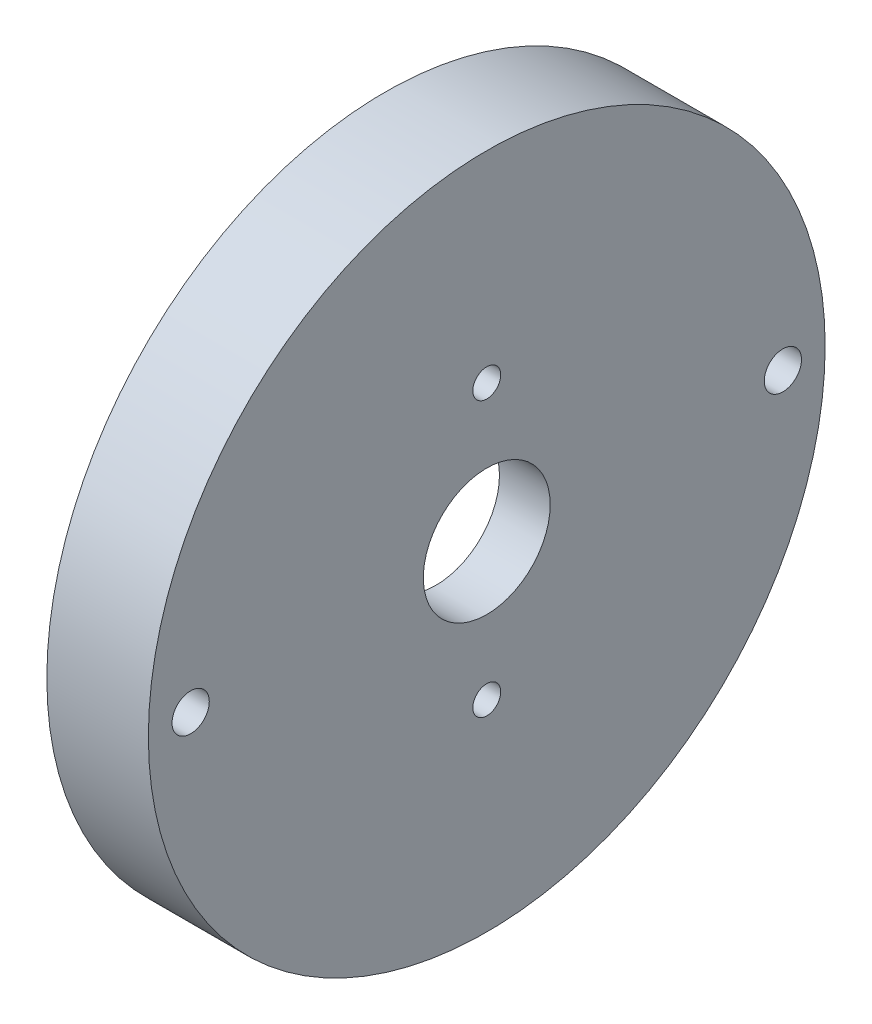
ISO-10303-21;
HEADER;
FILE_DESCRIPTION(('STEP AP214'),'2;1');
FILE_NAME('part.step','',(''),(''),'','','');
FILE_SCHEMA(('AUTOMOTIVE_DESIGN { 1 0 10303 214 1 1 1 1 }'));
ENDSEC;
DATA;
#1=APPLICATION_CONTEXT('core data for automotive mechanical design processes');
#2=APPLICATION_PROTOCOL_DEFINITION('international standard','automotive_design',2000,#1);
#3=PRODUCT_CONTEXT('',#1,'mechanical');
#4=PRODUCT('Part','Part','',(#3));
#5=PRODUCT_RELATED_PRODUCT_CATEGORY('part','',(#4));
#6=PRODUCT_DEFINITION_FORMATION('','',#4);
#7=PRODUCT_DEFINITION_CONTEXT('part definition',#1,'design');
#8=PRODUCT_DEFINITION('design','',#6,#7);
#9=PRODUCT_DEFINITION_SHAPE('','',#8);
#10=(LENGTH_UNIT() NAMED_UNIT(*) SI_UNIT(.MILLI.,.METRE.));
#11=(NAMED_UNIT(*) PLANE_ANGLE_UNIT() SI_UNIT($,.RADIAN.));
#12=(NAMED_UNIT(*) SI_UNIT($,.STERADIAN.) SOLID_ANGLE_UNIT());
#13=UNCERTAINTY_MEASURE_WITH_UNIT(LENGTH_MEASURE(1.E-05),#10,'distance_accuracy_value','');
#14=(GEOMETRIC_REPRESENTATION_CONTEXT(3) GLOBAL_UNCERTAINTY_ASSIGNED_CONTEXT((#13)) GLOBAL_UNIT_ASSIGNED_CONTEXT((#10,
#11,#12)) REPRESENTATION_CONTEXT('',''));
#15=CARTESIAN_POINT('',(0.,0.,0.));
#16=DIRECTION('',(0.,0.,1.));
#17=DIRECTION('',(1.,0.,0.));
#18=AXIS2_PLACEMENT_3D('',#15,#16,#17);
#19=CARTESIAN_POINT('',(6.,0.,0.));
#20=DIRECTION('',(-1.,0.,0.));
#21=DIRECTION('',(0.,0.,1.));
#22=AXIS2_PLACEMENT_3D('',#19,#20,#21);
#23=CYLINDRICAL_SURFACE('',#22,27.5);
#24=CARTESIAN_POINT('',(6.,0.,0.));
#25=DIRECTION('',(1.,0.,0.));
#26=DIRECTION('',(0.,0.,-1.));
#27=AXIS2_PLACEMENT_3D('',#24,#25,#26);
#28=CIRCLE('',#27,27.5);
#29=CARTESIAN_POINT('',(6.,0.,-27.5));
#30=VERTEX_POINT('',#29);
#31=EDGE_CURVE('E43',#30,#30,#28,.T.);
#32=ORIENTED_EDGE('',*,*,#31,.T.);
#33=EDGE_LOOP('',(#32));
#34=FACE_BOUND('',#33,.T.);
#35=CARTESIAN_POINT('',(0.,0.,0.));
#36=DIRECTION('',(1.,0.,0.));
#37=DIRECTION('',(0.,0.,-1.));
#38=AXIS2_PLACEMENT_3D('',#35,#36,#37);
#39=CIRCLE('',#38,27.5);
#40=CARTESIAN_POINT('',(0.,0.,-27.5));
#41=VERTEX_POINT('',#40);
#42=EDGE_CURVE('E39',#41,#41,#39,.T.);
#43=ORIENTED_EDGE('',*,*,#42,.F.);
#44=EDGE_LOOP('',(#43));
#45=FACE_BOUND('',#44,.T.);
#46=ADVANCED_FACE('F33',(#34,#45),#23,.F.);
#47=CARTESIAN_POINT('',(6.,0.,0.));
#48=DIRECTION('',(-1.,0.,0.));
#49=DIRECTION('',(0.,0.,1.));
#50=AXIS2_PLACEMENT_3D('',#47,#48,#49);
#51=CYLINDRICAL_SURFACE('',#50,40.);
#52=CARTESIAN_POINT('',(0.,0.,0.));
#53=DIRECTION('',(1.,0.,0.));
#54=DIRECTION('',(0.,0.,-1.));
#55=AXIS2_PLACEMENT_3D('',#52,#53,#54);
#56=CIRCLE('',#55,40.);
#57=CARTESIAN_POINT('',(0.,0.,-40.));
#58=VERTEX_POINT('',#57);
#59=EDGE_CURVE('E10',#58,#58,#56,.T.);
#60=ORIENTED_EDGE('',*,*,#59,.T.);
#61=EDGE_LOOP('',(#60));
#62=FACE_BOUND('',#61,.T.);
#63=CARTESIAN_POINT('',(12.,0.,0.));
#64=DIRECTION('',(1.,0.,0.));
#65=DIRECTION('',(0.,0.,-1.));
#66=AXIS2_PLACEMENT_3D('',#63,#64,#65);
#67=CIRCLE('',#66,40.);
#68=CARTESIAN_POINT('',(12.,0.,-40.));
#69=VERTEX_POINT('',#68);
#70=EDGE_CURVE('E53',#69,#69,#67,.T.);
#71=ORIENTED_EDGE('',*,*,#70,.F.);
#72=EDGE_LOOP('',(#71));
#73=FACE_BOUND('',#72,.T.);
#74=ADVANCED_FACE('F133',(#62,#73),#51,.T.);
#75=CARTESIAN_POINT('',(0.,0.,0.));
#76=DIRECTION('',(1.,0.,0.));
#77=DIRECTION('',(0.,0.,-1.));
#78=AXIS2_PLACEMENT_3D('',#75,#76,#77);
#79=PLANE('',#78);
#80=CARTESIAN_POINT('',(0.,0.,35.));
#81=DIRECTION('',(1.,0.,0.));
#82=DIRECTION('',(0.,0.,-1.));
#83=AXIS2_PLACEMENT_3D('',#80,#81,#82);
#84=CIRCLE('',#83,1.2);
#85=CARTESIAN_POINT('',(0.,0.,33.8));
#86=VERTEX_POINT('',#85);
#87=EDGE_CURVE('E82',#86,#86,#84,.T.);
#88=ORIENTED_EDGE('',*,*,#87,.T.);
#89=EDGE_LOOP('',(#88));
#90=FACE_BOUND('',#89,.T.);
#91=CARTESIAN_POINT('',(0.,0.,-35.));
#92=DIRECTION('',(1.,0.,0.));
#93=DIRECTION('',(0.,0.,-1.));
#94=AXIS2_PLACEMENT_3D('',#91,#92,#93);
#95=CIRCLE('',#94,1.2);
#96=CARTESIAN_POINT('',(0.,0.,-36.2));
#97=VERTEX_POINT('',#96);
#98=EDGE_CURVE('E60',#97,#97,#95,.T.);
#99=ORIENTED_EDGE('',*,*,#98,.T.);
#100=EDGE_LOOP('',(#99));
#101=FACE_BOUND('',#100,.T.);
#102=ORIENTED_EDGE('',*,*,#42,.T.);
#103=EDGE_LOOP('',(#102));
#104=FACE_BOUND('',#103,.T.);
#105=ORIENTED_EDGE('',*,*,#59,.F.);
#106=EDGE_LOOP('',(#105));
#107=FACE_BOUND('',#106,.T.);
#108=ADVANCED_FACE('F123',(#90,#101,#104,#107),#79,.F.);
#109=CARTESIAN_POINT('',(6.,0.,0.));
#110=DIRECTION('',(1.,0.,0.));
#111=DIRECTION('',(0.,0.,-1.));
#112=AXIS2_PLACEMENT_3D('',#109,#110,#111);
#113=PLANE('',#112);
#114=CARTESIAN_POINT('',(6.,0.,0.));
#115=DIRECTION('',(1.,0.,0.));
#116=DIRECTION('',(0.,0.,-1.));
#117=AXIS2_PLACEMENT_3D('',#114,#115,#116);
#118=CIRCLE('',#117,7.5);
#119=CARTESIAN_POINT('',(6.,0.,-7.5));
#120=VERTEX_POINT('',#119);
#121=EDGE_CURVE('E50',#120,#120,#118,.T.);
#122=ORIENTED_EDGE('',*,*,#121,.T.);
#123=EDGE_LOOP('',(#122));
#124=FACE_BOUND('',#123,.T.);
#125=CARTESIAN_POINT('',(6.,16.22,0.));
#126=DIRECTION('',(1.,0.,0.));
#127=DIRECTION('',(0.,0.,-1.));
#128=AXIS2_PLACEMENT_3D('',#125,#126,#127);
#129=CIRCLE('',#128,1.65);
#130=CARTESIAN_POINT('',(6.,16.22,-1.65));
#131=VERTEX_POINT('',#130);
#132=EDGE_CURVE('E54',#131,#131,#129,.T.);
#133=ORIENTED_EDGE('',*,*,#132,.T.);
#134=EDGE_LOOP('',(#133));
#135=FACE_BOUND('',#134,.T.);
#136=CARTESIAN_POINT('',(6.,-16.22,0.));
#137=DIRECTION('',(1.,0.,0.));
#138=DIRECTION('',(0.,0.,-1.));
#139=AXIS2_PLACEMENT_3D('',#136,#137,#138);
#140=CIRCLE('',#139,1.65);
#141=CARTESIAN_POINT('',(6.,-16.22,-1.65));
#142=VERTEX_POINT('',#141);
#143=EDGE_CURVE('E57',#142,#142,#140,.T.);
#144=ORIENTED_EDGE('',*,*,#143,.T.);
#145=EDGE_LOOP('',(#144));
#146=FACE_BOUND('',#145,.T.);
#147=ORIENTED_EDGE('',*,*,#31,.F.);
#148=EDGE_LOOP('',(#147));
#149=FACE_BOUND('',#148,.T.);
#150=ADVANCED_FACE('F119',(#124,#135,#146,#149),#113,.F.);
#151=CARTESIAN_POINT('',(12.,16.22,0.));
#152=DIRECTION('',(-1.,0.,0.));
#153=DIRECTION('',(0.,0.,1.));
#154=AXIS2_PLACEMENT_3D('',#151,#152,#153);
#155=CYLINDRICAL_SURFACE('',#154,1.65);
#156=CARTESIAN_POINT('',(12.,16.22,0.));
#157=DIRECTION('',(1.,0.,0.));
#158=DIRECTION('',(0.,0.,-1.));
#159=AXIS2_PLACEMENT_3D('',#156,#157,#158);
#160=CIRCLE('',#159,1.65);
#161=CARTESIAN_POINT('',(12.,16.22,-1.65));
#162=VERTEX_POINT('',#161);
#163=EDGE_CURVE('E63',#162,#162,#160,.T.);
#164=ORIENTED_EDGE('',*,*,#163,.T.);
#165=EDGE_LOOP('',(#164));
#166=FACE_BOUND('',#165,.T.);
#167=ORIENTED_EDGE('',*,*,#132,.F.);
#168=EDGE_LOOP('',(#167));
#169=FACE_BOUND('',#168,.T.);
#170=ADVANCED_FACE('F122',(#166,#169),#155,.F.);
#171=CARTESIAN_POINT('',(12.,-16.22,0.));
#172=DIRECTION('',(-1.,0.,0.));
#173=DIRECTION('',(0.,0.,1.));
#174=AXIS2_PLACEMENT_3D('',#171,#172,#173);
#175=CYLINDRICAL_SURFACE('',#174,1.65);
#176=CARTESIAN_POINT('',(12.,-16.22,0.));
#177=DIRECTION('',(1.,0.,0.));
#178=DIRECTION('',(0.,0.,-1.));
#179=AXIS2_PLACEMENT_3D('',#176,#177,#178);
#180=CIRCLE('',#179,1.65);
#181=CARTESIAN_POINT('',(12.,-16.22,-1.65));
#182=VERTEX_POINT('',#181);
#183=EDGE_CURVE('E66',#182,#182,#180,.T.);
#184=ORIENTED_EDGE('',*,*,#183,.T.);
#185=EDGE_LOOP('',(#184));
#186=FACE_BOUND('',#185,.T.);
#187=ORIENTED_EDGE('',*,*,#143,.F.);
#188=EDGE_LOOP('',(#187));
#189=FACE_BOUND('',#188,.T.);
#190=ADVANCED_FACE('F115',(#186,#189),#175,.F.);
#191=CARTESIAN_POINT('',(12.,0.,0.));
#192=DIRECTION('',(-1.,0.,0.));
#193=DIRECTION('',(0.,0.,1.));
#194=AXIS2_PLACEMENT_3D('',#191,#192,#193);
#195=CYLINDRICAL_SURFACE('',#194,7.5);
#196=CARTESIAN_POINT('',(12.,0.,0.));
#197=DIRECTION('',(1.,0.,0.));
#198=DIRECTION('',(0.,0.,-1.));
#199=AXIS2_PLACEMENT_3D('',#196,#197,#198);
#200=CIRCLE('',#199,7.5);
#201=CARTESIAN_POINT('',(12.,0.,-7.5));
#202=VERTEX_POINT('',#201);
#203=EDGE_CURVE('E47',#202,#202,#200,.T.);
#204=ORIENTED_EDGE('',*,*,#203,.T.);
#205=EDGE_LOOP('',(#204));
#206=FACE_BOUND('',#205,.T.);
#207=ORIENTED_EDGE('',*,*,#121,.F.);
#208=EDGE_LOOP('',(#207));
#209=FACE_BOUND('',#208,.T.);
#210=ADVANCED_FACE('F101',(#206,#209),#195,.F.);
#211=CARTESIAN_POINT('',(12.,0.,0.));
#212=DIRECTION('',(1.,0.,0.));
#213=DIRECTION('',(0.,0.,-1.));
#214=AXIS2_PLACEMENT_3D('',#211,#212,#213);
#215=PLANE('',#214);
#216=CARTESIAN_POINT('',(12.,0.,35.));
#217=DIRECTION('',(1.,0.,0.));
#218=DIRECTION('',(0.,0.,-1.));
#219=AXIS2_PLACEMENT_3D('',#216,#217,#218);
#220=CIRCLE('',#219,2.2);
#221=CARTESIAN_POINT('',(12.,0.,32.8));
#222=VERTEX_POINT('',#221);
#223=EDGE_CURVE('E91',#222,#222,#220,.T.);
#224=ORIENTED_EDGE('',*,*,#223,.F.);
#225=EDGE_LOOP('',(#224));
#226=FACE_BOUND('',#225,.T.);
#227=CARTESIAN_POINT('',(12.,0.,-35.));
#228=DIRECTION('',(1.,0.,0.));
#229=DIRECTION('',(0.,0.,-1.));
#230=AXIS2_PLACEMENT_3D('',#227,#228,#229);
#231=CIRCLE('',#230,2.2);
#232=CARTESIAN_POINT('',(12.,0.,-37.2));
#233=VERTEX_POINT('',#232);
#234=EDGE_CURVE('E79',#233,#233,#231,.T.);
#235=ORIENTED_EDGE('',*,*,#234,.F.);
#236=EDGE_LOOP('',(#235));
#237=FACE_BOUND('',#236,.T.);
#238=ORIENTED_EDGE('',*,*,#70,.T.);
#239=EDGE_LOOP('',(#238));
#240=FACE_BOUND('',#239,.T.);
#241=ORIENTED_EDGE('',*,*,#183,.F.);
#242=EDGE_LOOP('',(#241));
#243=FACE_BOUND('',#242,.T.);
#244=ORIENTED_EDGE('',*,*,#163,.F.);
#245=EDGE_LOOP('',(#244));
#246=FACE_BOUND('',#245,.T.);
#247=ORIENTED_EDGE('',*,*,#203,.F.);
#248=EDGE_LOOP('',(#247));
#249=FACE_BOUND('',#248,.T.);
#250=ADVANCED_FACE('F97',(#226,#237,#240,#243,#246,#249),#215,.T.);
#251=CARTESIAN_POINT('',(12.,0.,-35.));
#252=DIRECTION('',(1.,0.,0.));
#253=DIRECTION('',(0.,0.,-1.));
#254=AXIS2_PLACEMENT_3D('',#251,#252,#253);
#255=CYLINDRICAL_SURFACE('',#254,1.2);
#256=ORIENTED_EDGE('',*,*,#98,.F.);
#257=EDGE_LOOP('',(#256));
#258=FACE_BOUND('',#257,.T.);
#259=CARTESIAN_POINT('',(3.75,0.,-35.));
#260=DIRECTION('',(1.,0.,0.));
#261=DIRECTION('',(0.,0.,-1.));
#262=AXIS2_PLACEMENT_3D('',#259,#260,#261);
#263=CIRCLE('',#262,1.2);
#264=CARTESIAN_POINT('',(3.75,0.,-36.2));
#265=VERTEX_POINT('',#264);
#266=EDGE_CURVE('E73',#265,#265,#263,.T.);
#267=ORIENTED_EDGE('',*,*,#266,.T.);
#268=EDGE_LOOP('',(#267));
#269=FACE_BOUND('',#268,.T.);
#270=ADVANCED_FACE('F100',(#258,#269),#255,.F.);
#271=CARTESIAN_POINT('',(3.75,1.20000000000001,-35.));
#272=DIRECTION('',(-1.,0.,0.));
#273=DIRECTION('',(0.,0.,1.));
#274=AXIS2_PLACEMENT_3D('',#271,#272,#273);
#275=PLANE('',#274);
#276=ORIENTED_EDGE('',*,*,#266,.F.);
#277=EDGE_LOOP('',(#276));
#278=FACE_BOUND('',#277,.T.);
#279=CARTESIAN_POINT('',(3.75,0.,-35.));
#280=DIRECTION('',(1.,0.,0.));
#281=DIRECTION('',(0.,0.,-1.));
#282=AXIS2_PLACEMENT_3D('',#279,#280,#281);
#283=CIRCLE('',#282,2.2);
#284=CARTESIAN_POINT('',(3.75,0.,-37.2));
#285=VERTEX_POINT('',#284);
#286=EDGE_CURVE('E76',#285,#285,#283,.T.);
#287=ORIENTED_EDGE('',*,*,#286,.T.);
#288=EDGE_LOOP('',(#287));
#289=FACE_BOUND('',#288,.T.);
#290=ADVANCED_FACE('F152',(#278,#289),#275,.F.);
#291=CARTESIAN_POINT('',(12.,0.,-35.));
#292=DIRECTION('',(1.,0.,0.));
#293=DIRECTION('',(0.,0.,-1.));
#294=AXIS2_PLACEMENT_3D('',#291,#292,#293);
#295=CYLINDRICAL_SURFACE('',#294,2.2);
#296=ORIENTED_EDGE('',*,*,#286,.F.);
#297=EDGE_LOOP('',(#296));
#298=FACE_BOUND('',#297,.T.);
#299=ORIENTED_EDGE('',*,*,#234,.T.);
#300=EDGE_LOOP('',(#299));
#301=FACE_BOUND('',#300,.T.);
#302=ADVANCED_FACE('F156',(#298,#301),#295,.F.);
#303=CARTESIAN_POINT('',(12.,0.,35.));
#304=DIRECTION('',(1.,0.,0.));
#305=DIRECTION('',(0.,0.,-1.));
#306=AXIS2_PLACEMENT_3D('',#303,#304,#305);
#307=CYLINDRICAL_SURFACE('',#306,1.2);
#308=ORIENTED_EDGE('',*,*,#87,.F.);
#309=EDGE_LOOP('',(#308));
#310=FACE_BOUND('',#309,.T.);
#311=CARTESIAN_POINT('',(3.75,0.,35.));
#312=DIRECTION('',(1.,0.,0.));
#313=DIRECTION('',(0.,0.,-1.));
#314=AXIS2_PLACEMENT_3D('',#311,#312,#313);
#315=CIRCLE('',#314,1.2);
#316=CARTESIAN_POINT('',(3.75,0.,33.8));
#317=VERTEX_POINT('',#316);
#318=EDGE_CURVE('E85',#317,#317,#315,.T.);
#319=ORIENTED_EDGE('',*,*,#318,.T.);
#320=EDGE_LOOP('',(#319));
#321=FACE_BOUND('',#320,.T.);
#322=ADVANCED_FACE('F160',(#310,#321),#307,.F.);
#323=CARTESIAN_POINT('',(3.75,1.2,35.));
#324=DIRECTION('',(-1.,0.,0.));
#325=DIRECTION('',(0.,0.,1.));
#326=AXIS2_PLACEMENT_3D('',#323,#324,#325);
#327=PLANE('',#326);
#328=ORIENTED_EDGE('',*,*,#318,.F.);
#329=EDGE_LOOP('',(#328));
#330=FACE_BOUND('',#329,.T.);
#331=CARTESIAN_POINT('',(3.75,0.,35.));
#332=DIRECTION('',(1.,0.,0.));
#333=DIRECTION('',(0.,0.,-1.));
#334=AXIS2_PLACEMENT_3D('',#331,#332,#333);
#335=CIRCLE('',#334,2.2);
#336=CARTESIAN_POINT('',(3.75,0.,32.8));
#337=VERTEX_POINT('',#336);
#338=EDGE_CURVE('E88',#337,#337,#335,.T.);
#339=ORIENTED_EDGE('',*,*,#338,.T.);
#340=EDGE_LOOP('',(#339));
#341=FACE_BOUND('',#340,.T.);
#342=ADVANCED_FACE('F164',(#330,#341),#327,.F.);
#343=CARTESIAN_POINT('',(12.,0.,35.));
#344=DIRECTION('',(1.,0.,0.));
#345=DIRECTION('',(0.,0.,-1.));
#346=AXIS2_PLACEMENT_3D('',#343,#344,#345);
#347=CYLINDRICAL_SURFACE('',#346,2.2);
#348=ORIENTED_EDGE('',*,*,#338,.F.);
#349=EDGE_LOOP('',(#348));
#350=FACE_BOUND('',#349,.T.);
#351=ORIENTED_EDGE('',*,*,#223,.T.);
#352=EDGE_LOOP('',(#351));
#353=FACE_BOUND('',#352,.T.);
#354=ADVANCED_FACE('F95',(#350,#353),#347,.F.);
#355=CLOSED_SHELL('',(#46,#74,#108,#150,#170,#190,#210,#250,#270,#290,#302,#322,#342,#354));
#356=MANIFOLD_SOLID_BREP('B2',#355);
#357=ADVANCED_BREP_SHAPE_REPRESENTATION('',(#18,#356),#14);
#358=SHAPE_DEFINITION_REPRESENTATION(#9,#357);
ENDSEC;
END-ISO-10303-21;
